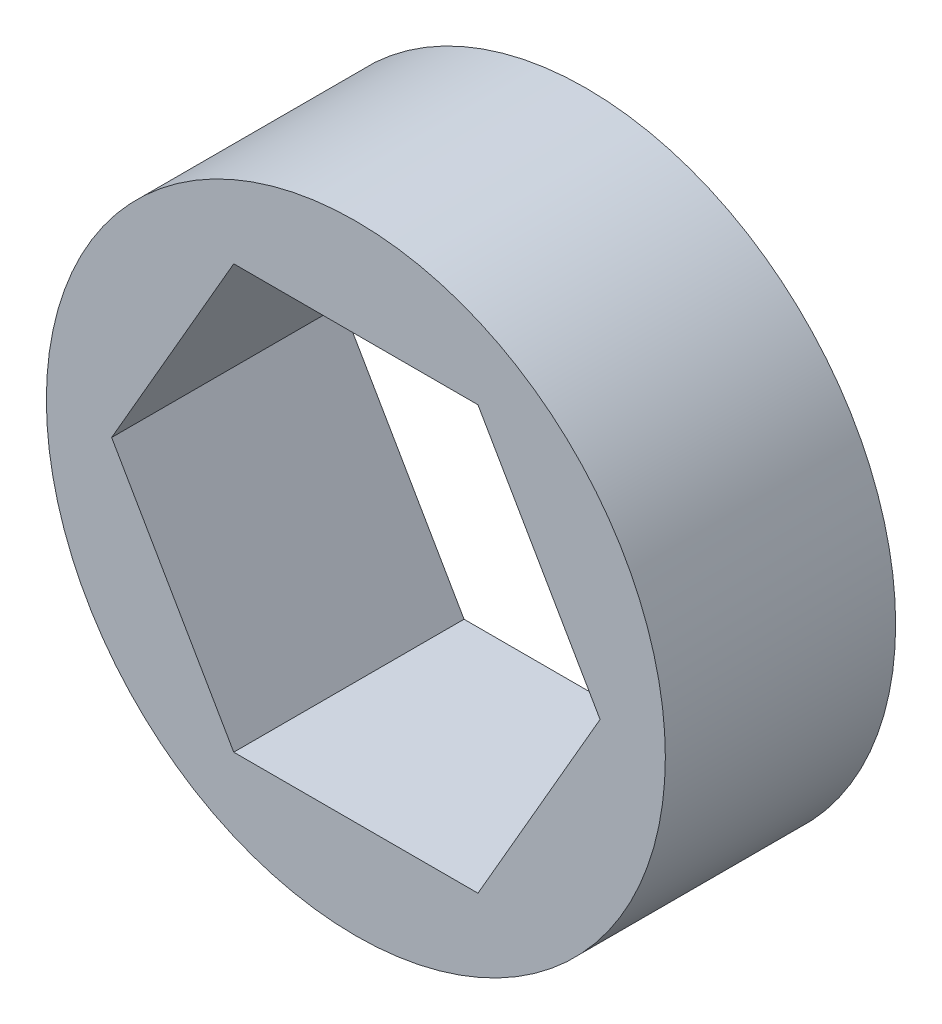
ISO-10303-21;
HEADER;
FILE_DESCRIPTION(('STEP AP214'),'2;1');
FILE_NAME('part.step','',(''),(''),'','','');
FILE_SCHEMA(('AUTOMOTIVE_DESIGN { 1 0 10303 214 1 1 1 1 }'));
ENDSEC;
DATA;
#1=APPLICATION_CONTEXT('core data for automotive mechanical design processes');
#2=APPLICATION_PROTOCOL_DEFINITION('international standard','automotive_design',2000,#1);
#3=PRODUCT_CONTEXT('',#1,'mechanical');
#4=PRODUCT('Part','Part','',(#3));
#5=PRODUCT_RELATED_PRODUCT_CATEGORY('part','',(#4));
#6=PRODUCT_DEFINITION_FORMATION('','',#4);
#7=PRODUCT_DEFINITION_CONTEXT('part definition',#1,'design');
#8=PRODUCT_DEFINITION('design','',#6,#7);
#9=PRODUCT_DEFINITION_SHAPE('','',#8);
#10=(LENGTH_UNIT() NAMED_UNIT(*) SI_UNIT(.MILLI.,.METRE.));
#11=(NAMED_UNIT(*) PLANE_ANGLE_UNIT() SI_UNIT($,.RADIAN.));
#12=(NAMED_UNIT(*) SI_UNIT($,.STERADIAN.) SOLID_ANGLE_UNIT());
#13=UNCERTAINTY_MEASURE_WITH_UNIT(LENGTH_MEASURE(1.E-05),#10,'distance_accuracy_value','');
#14=(GEOMETRIC_REPRESENTATION_CONTEXT(3) GLOBAL_UNCERTAINTY_ASSIGNED_CONTEXT((#13)) GLOBAL_UNIT_ASSIGNED_CONTEXT((#10,
#11,#12)) REPRESENTATION_CONTEXT('',''));
#15=CARTESIAN_POINT('',(0.,0.,0.));
#16=DIRECTION('',(0.,0.,1.));
#17=DIRECTION('',(1.,0.,0.));
#18=AXIS2_PLACEMENT_3D('',#15,#16,#17);
#19=CARTESIAN_POINT('',(0.,0.,7.08753086));
#20=DIRECTION('',(0.,0.,1.));
#21=DIRECTION('',(1.,0.,0.));
#22=AXIS2_PLACEMENT_3D('',#19,#20,#21);
#23=PLANE('',#22);
#24=CARTESIAN_POINT('',(0.,0.,7.08753086));
#25=DIRECTION('',(0.,0.,1.));
#26=DIRECTION('',(1.,0.,0.));
#27=AXIS2_PLACEMENT_3D('',#24,#25,#26);
#28=CIRCLE('',#27,9.525);
#29=CARTESIAN_POINT('',(-9.525,0.,7.08753086));
#30=VERTEX_POINT('',#29);
#31=EDGE_CURVE('E11',#30,#30,#28,.T.);
#32=ORIENTED_EDGE('',*,*,#31,.T.);
#33=EDGE_LOOP('',(#32));
#34=FACE_BOUND('',#33,.T.);
#35=DIRECTION('',(-0.500000000000001,0.866025403784438,0.));
#36=VECTOR('',#35,1.);
#37=CARTESIAN_POINT('',(7.51565712917592,0.,7.08753086));
#38=LINE('',#37,#36);
#39=CARTESIAN_POINT('',(7.51565712917592,0.,7.08753086));
#40=VERTEX_POINT('',#39);
#41=CARTESIAN_POINT('',(3.75782856458794,6.50874999999997,7.08753086));
#42=VERTEX_POINT('',#41);
#43=EDGE_CURVE('E102',#40,#42,#38,.T.);
#44=ORIENTED_EDGE('',*,*,#43,.F.);
#45=DIRECTION('',(0.499999999999995,0.866025403784441,0.));
#46=VECTOR('',#45,1.);
#47=CARTESIAN_POINT('',(3.75782856458803,-6.50874999999992,7.08753086));
#48=LINE('',#47,#46);
#49=CARTESIAN_POINT('',(3.75782856458803,-6.50874999999992,7.08753086));
#50=VERTEX_POINT('',#49);
#51=EDGE_CURVE('E94',#50,#40,#48,.T.);
#52=ORIENTED_EDGE('',*,*,#51,.F.);
#53=DIRECTION('',(1.,0.,0.));
#54=VECTOR('',#53,1.);
#55=CARTESIAN_POINT('',(-3.7578285645879,-6.50875,7.08753086));
#56=LINE('',#55,#54);
#57=CARTESIAN_POINT('',(-3.7578285645879,-6.50875,7.08753086));
#58=VERTEX_POINT('',#57);
#59=EDGE_CURVE('E122',#58,#50,#56,.T.);
#60=ORIENTED_EDGE('',*,*,#59,.F.);
#61=DIRECTION('',(0.500000000000007,-0.866025403784435,0.));
#62=VECTOR('',#61,1.);
#63=CARTESIAN_POINT('',(-7.51565712917591,0.,7.08753086));
#64=LINE('',#63,#62);
#65=CARTESIAN_POINT('',(-7.51565712917591,0.,7.08753086));
#66=VERTEX_POINT('',#65);
#67=EDGE_CURVE('E120',#66,#58,#64,.T.);
#68=ORIENTED_EDGE('',*,*,#67,.F.);
#69=DIRECTION('',(-0.499999999999995,-0.866025403784442,0.));
#70=VECTOR('',#69,1.);
#71=CARTESIAN_POINT('',(-3.75782856458799,6.50874999999995,7.08753086));
#72=LINE('',#71,#70);
#73=CARTESIAN_POINT('',(-3.75782856458799,6.50874999999995,7.08753086));
#74=VERTEX_POINT('',#73);
#75=EDGE_CURVE('E116',#74,#66,#72,.T.);
#76=ORIENTED_EDGE('',*,*,#75,.F.);
#77=DIRECTION('',(-1.,0.,0.));
#78=VECTOR('',#77,1.);
#79=CARTESIAN_POINT('',(3.75782856458794,6.50874999999997,7.08753086));
#80=LINE('',#79,#78);
#81=EDGE_CURVE('E114',#42,#74,#80,.T.);
#82=ORIENTED_EDGE('',*,*,#81,.F.);
#83=EDGE_LOOP('',(#44,#52,#60,#68,#76,#82));
#84=FACE_BOUND('',#83,.T.);
#85=ADVANCED_FACE('F41',(#34,#84),#23,.T.);
#86=CARTESIAN_POINT('',(0.,0.,0.));
#87=DIRECTION('',(0.,0.,1.));
#88=DIRECTION('',(1.,0.,0.));
#89=AXIS2_PLACEMENT_3D('',#86,#87,#88);
#90=PLANE('',#89);
#91=CARTESIAN_POINT('',(0.,0.,0.));
#92=DIRECTION('',(0.,0.,1.));
#93=DIRECTION('',(1.,0.,0.));
#94=AXIS2_PLACEMENT_3D('',#91,#92,#93);
#95=CIRCLE('',#94,9.525);
#96=CARTESIAN_POINT('',(-9.525,0.,0.));
#97=VERTEX_POINT('',#96);
#98=EDGE_CURVE('E45',#97,#97,#95,.T.);
#99=ORIENTED_EDGE('',*,*,#98,.F.);
#100=EDGE_LOOP('',(#99));
#101=FACE_BOUND('',#100,.T.);
#102=DIRECTION('',(0.499999999999995,0.866025403784441,0.));
#103=VECTOR('',#102,1.);
#104=CARTESIAN_POINT('',(3.75782856458803,-6.50874999999992,0.));
#105=LINE('',#104,#103);
#106=CARTESIAN_POINT('',(3.75782856458803,-6.50874999999992,0.));
#107=VERTEX_POINT('',#106);
#108=CARTESIAN_POINT('',(7.51565712917592,0.,0.));
#109=VERTEX_POINT('',#108);
#110=EDGE_CURVE('E64',#107,#109,#105,.T.);
#111=ORIENTED_EDGE('',*,*,#110,.T.);
#112=DIRECTION('',(-0.500000000000001,0.866025403784438,0.));
#113=VECTOR('',#112,1.);
#114=CARTESIAN_POINT('',(7.51565712917592,0.,0.));
#115=LINE('',#114,#113);
#116=CARTESIAN_POINT('',(3.75782856458794,6.50874999999997,0.));
#117=VERTEX_POINT('',#116);
#118=EDGE_CURVE('E109',#109,#117,#115,.T.);
#119=ORIENTED_EDGE('',*,*,#118,.T.);
#120=DIRECTION('',(-1.,0.,0.));
#121=VECTOR('',#120,1.);
#122=CARTESIAN_POINT('',(3.75782856458794,6.50874999999997,0.));
#123=LINE('',#122,#121);
#124=CARTESIAN_POINT('',(-3.75782856458799,6.50874999999995,0.));
#125=VERTEX_POINT('',#124);
#126=EDGE_CURVE('E126',#117,#125,#123,.T.);
#127=ORIENTED_EDGE('',*,*,#126,.T.);
#128=DIRECTION('',(-0.499999999999995,-0.866025403784442,0.));
#129=VECTOR('',#128,1.);
#130=CARTESIAN_POINT('',(-3.75782856458799,6.50874999999995,0.));
#131=LINE('',#130,#129);
#132=CARTESIAN_POINT('',(-7.51565712917591,0.,0.));
#133=VERTEX_POINT('',#132);
#134=EDGE_CURVE('E129',#125,#133,#131,.T.);
#135=ORIENTED_EDGE('',*,*,#134,.T.);
#136=DIRECTION('',(0.500000000000007,-0.866025403784435,0.));
#137=VECTOR('',#136,1.);
#138=CARTESIAN_POINT('',(-7.51565712917591,0.,0.));
#139=LINE('',#138,#137);
#140=CARTESIAN_POINT('',(-3.7578285645879,-6.50875,0.));
#141=VERTEX_POINT('',#140);
#142=EDGE_CURVE('E132',#133,#141,#139,.T.);
#143=ORIENTED_EDGE('',*,*,#142,.T.);
#144=DIRECTION('',(1.,0.,0.));
#145=VECTOR('',#144,1.);
#146=CARTESIAN_POINT('',(-3.7578285645879,-6.50875,0.));
#147=LINE('',#146,#145);
#148=EDGE_CURVE('E103',#141,#107,#147,.T.);
#149=ORIENTED_EDGE('',*,*,#148,.T.);
#150=EDGE_LOOP('',(#111,#119,#127,#135,#143,#149));
#151=FACE_BOUND('',#150,.T.);
#152=ADVANCED_FACE('F149',(#101,#151),#90,.F.);
#153=CARTESIAN_POINT('',(0.,0.,7.08753086));
#154=DIRECTION('',(0.,0.,-1.));
#155=DIRECTION('',(-1.,0.,0.));
#156=AXIS2_PLACEMENT_3D('',#153,#154,#155);
#157=CYLINDRICAL_SURFACE('',#156,9.525);
#158=CARTESIAN_POINT('',(-9.525,0.,7.08753086));
#159=CARTESIAN_POINT('',(-9.525,0.,7.01370241354167));
#160=CARTESIAN_POINT('',(-9.525,0.,6.93987396708333));
#161=CARTESIAN_POINT('',(-9.525,0.,6.79221707416667));
#162=CARTESIAN_POINT('',(-9.525,0.,6.71838862770833));
#163=CARTESIAN_POINT('',(-9.525,0.,6.57073173479167));
#164=CARTESIAN_POINT('',(-9.525,0.,6.49690328833333));
#165=CARTESIAN_POINT('',(-9.525,0.,6.34924639541667));
#166=CARTESIAN_POINT('',(-9.525,0.,6.27541794895833));
#167=CARTESIAN_POINT('',(-9.525,0.,6.12776105604167));
#168=CARTESIAN_POINT('',(-9.525,0.,6.05393260958333));
#169=CARTESIAN_POINT('',(-9.525,0.,5.90627571666667));
#170=CARTESIAN_POINT('',(-9.525,0.,5.83244727020833));
#171=CARTESIAN_POINT('',(-9.525,0.,5.68479037729167));
#172=CARTESIAN_POINT('',(-9.525,0.,5.61096193083333));
#173=CARTESIAN_POINT('',(-9.525,0.,5.46330503791667));
#174=CARTESIAN_POINT('',(-9.525,0.,5.38947659145833));
#175=CARTESIAN_POINT('',(-9.525,0.,5.24181969854167));
#176=CARTESIAN_POINT('',(-9.525,0.,5.16799125208333));
#177=CARTESIAN_POINT('',(-9.525,0.,5.02033435916667));
#178=CARTESIAN_POINT('',(-9.525,0.,4.94650591270833));
#179=CARTESIAN_POINT('',(-9.525,0.,4.79884901979167));
#180=CARTESIAN_POINT('',(-9.525,0.,4.72502057333333));
#181=CARTESIAN_POINT('',(-9.525,0.,4.57736368041667));
#182=CARTESIAN_POINT('',(-9.525,0.,4.50353523395833));
#183=CARTESIAN_POINT('',(-9.525,0.,4.35587834104167));
#184=CARTESIAN_POINT('',(-9.525,0.,4.28204989458333));
#185=CARTESIAN_POINT('',(-9.525,0.,4.13439300166667));
#186=CARTESIAN_POINT('',(-9.525,0.,4.06056455520833));
#187=CARTESIAN_POINT('',(-9.525,0.,3.91290766229167));
#188=CARTESIAN_POINT('',(-9.525,0.,3.83907921583333));
#189=CARTESIAN_POINT('',(-9.525,0.,3.69142232291667));
#190=CARTESIAN_POINT('',(-9.525,0.,3.61759387645833));
#191=CARTESIAN_POINT('',(-9.525,0.,3.46993698354167));
#192=CARTESIAN_POINT('',(-9.525,0.,3.39610853708333));
#193=CARTESIAN_POINT('',(-9.525,0.,3.24845164416667));
#194=CARTESIAN_POINT('',(-9.525,0.,3.17462319770833));
#195=CARTESIAN_POINT('',(-9.525,0.,3.02696630479167));
#196=CARTESIAN_POINT('',(-9.525,0.,2.95313785833333));
#197=CARTESIAN_POINT('',(-9.525,0.,2.80548096541667));
#198=CARTESIAN_POINT('',(-9.525,0.,2.73165251895833));
#199=CARTESIAN_POINT('',(-9.525,0.,2.58399562604167));
#200=CARTESIAN_POINT('',(-9.525,0.,2.51016717958333));
#201=CARTESIAN_POINT('',(-9.525,0.,2.36251028666667));
#202=CARTESIAN_POINT('',(-9.525,0.,2.28868184020833));
#203=CARTESIAN_POINT('',(-9.525,0.,2.14102494729167));
#204=CARTESIAN_POINT('',(-9.525,0.,2.06719650083333));
#205=CARTESIAN_POINT('',(-9.525,0.,1.91953960791667));
#206=CARTESIAN_POINT('',(-9.525,0.,1.84571116145833));
#207=CARTESIAN_POINT('',(-9.525,0.,1.69805426854167));
#208=CARTESIAN_POINT('',(-9.525,0.,1.62422582208333));
#209=CARTESIAN_POINT('',(-9.525,0.,1.47656892916667));
#210=CARTESIAN_POINT('',(-9.525,0.,1.40274048270833));
#211=CARTESIAN_POINT('',(-9.525,0.,1.25508358979167));
#212=CARTESIAN_POINT('',(-9.525,0.,1.18125514333333));
#213=CARTESIAN_POINT('',(-9.525,0.,1.03359825041667));
#214=CARTESIAN_POINT('',(-9.525,0.,0.959769803958333));
#215=CARTESIAN_POINT('',(-9.525,0.,0.812112911041666));
#216=CARTESIAN_POINT('',(-9.525,0.,0.738284464583332));
#217=CARTESIAN_POINT('',(-9.525,0.,0.590627571666665));
#218=CARTESIAN_POINT('',(-9.525,0.,0.516799125208332));
#219=CARTESIAN_POINT('',(-9.525,0.,0.369142232291666));
#220=CARTESIAN_POINT('',(-9.525,0.,0.295313785833332));
#221=CARTESIAN_POINT('',(-9.525,0.,0.147656892916666));
#222=CARTESIAN_POINT('',(-9.525,0.,0.0738284464583324));
#223=CARTESIAN_POINT('',(-9.525,0.,0.));
#224=B_SPLINE_CURVE_WITH_KNOTS('',3,(#158,#159,#160,#161,#162,#163,#164,#165,#166,#167,#168,
#169,#170,#171,#172,#173,#174,#175,#176,#177,#178,#179,#180,#181,#182,#183,#184,#185,#186,#187,
#188,#189,#190,#191,#192,#193,#194,#195,#196,#197,#198,#199,#200,#201,#202,#203,#204,#205,#206,
#207,#208,#209,#210,#211,#212,#213,#214,#215,#216,#217,#218,#219,#220,#221,#222,#223),
.UNSPECIFIED.,.F.,.F.,(4,2,2,2,2,2,2,2,2,2,2,2,2,2,2,2,2,2,2,2,2,2,2,2,2,2,2,2,2,2,2,2,4),(0.,
0.221485339375,0.44297067875,0.664456018125,0.8859413575,1.107426696875,1.32891203625,
1.550397375625,1.771882715,1.993368054375,2.21485339375,2.436338733125,2.6578240725,
2.879309411875,3.10079475125,3.322280090625,3.54376543,3.765250769375,3.98673610875,
4.208221448125,4.4297067875,4.651192126875,4.87267746625,5.094162805625,5.315648145,
5.537133484375,5.75861882375,5.980104163125,6.2015895025,6.423074841875,6.64456018125,
6.866045520625,7.08753086),.UNSPECIFIED.);
#225=EDGE_CURVE('BSEAM43',#30,#97,#224,.T.);
#226=ORIENTED_EDGE('',*,*,#31,.F.);
#227=ORIENTED_EDGE('',*,*,#98,.T.);
#228=ORIENTED_EDGE('',*,*,#225,.T.);
#229=ORIENTED_EDGE('',*,*,#225,.F.);
#230=EDGE_LOOP('',(#226,#228,#227,#229));
#231=FACE_BOUND('',#230,.T.);
#232=ADVANCED_FACE('F43',(#231),#157,.T.);
#233=CARTESIAN_POINT('',(3.75782856458803,-6.50874999999992,7.08753086));
#234=DIRECTION('',(-0.866025403784441,0.499999999999995,0.));
#235=DIRECTION('',(-0.499999999999995,-0.866025403784442,0.));
#236=AXIS2_PLACEMENT_3D('',#233,#234,#235);
#237=PLANE('',#236);
#238=ORIENTED_EDGE('',*,*,#110,.F.);
#239=DIRECTION('',(0.,0.,-1.));
#240=VECTOR('',#239,1.);
#241=CARTESIAN_POINT('',(3.75782856458803,-6.50874999999992,7.08753086));
#242=LINE('',#241,#240);
#243=EDGE_CURVE('E98',#50,#107,#242,.T.);
#244=ORIENTED_EDGE('',*,*,#243,.F.);
#245=ORIENTED_EDGE('',*,*,#51,.T.);
#246=DIRECTION('',(0.,0.,-1.));
#247=VECTOR('',#246,1.);
#248=CARTESIAN_POINT('',(7.51565712917592,0.,7.08753086));
#249=LINE('',#248,#247);
#250=EDGE_CURVE('E97',#40,#109,#249,.T.);
#251=ORIENTED_EDGE('',*,*,#250,.T.);
#252=EDGE_LOOP('',(#238,#244,#245,#251));
#253=FACE_BOUND('',#252,.T.);
#254=ADVANCED_FACE('F96',(#253),#237,.T.);
#255=CARTESIAN_POINT('',(7.51565712917592,0.,7.08753086));
#256=DIRECTION('',(-0.866025403784438,-0.500000000000001,0.));
#257=DIRECTION('',(0.500000000000001,-0.866025403784438,0.));
#258=AXIS2_PLACEMENT_3D('',#255,#256,#257);
#259=PLANE('',#258);
#260=ORIENTED_EDGE('',*,*,#118,.F.);
#261=ORIENTED_EDGE('',*,*,#250,.F.);
#262=ORIENTED_EDGE('',*,*,#43,.T.);
#263=DIRECTION('',(0.,0.,-1.));
#264=VECTOR('',#263,1.);
#265=CARTESIAN_POINT('',(3.75782856458794,6.50874999999997,7.08753086));
#266=LINE('',#265,#264);
#267=EDGE_CURVE('E110',#42,#117,#266,.T.);
#268=ORIENTED_EDGE('',*,*,#267,.T.);
#269=EDGE_LOOP('',(#260,#261,#262,#268));
#270=FACE_BOUND('',#269,.T.);
#271=ADVANCED_FACE('F106',(#270),#259,.T.);
#272=CARTESIAN_POINT('',(3.75782856458794,6.50874999999997,7.08753086));
#273=DIRECTION('',(0.,-1.,0.));
#274=DIRECTION('',(1.,0.,0.));
#275=AXIS2_PLACEMENT_3D('',#272,#273,#274);
#276=PLANE('',#275);
#277=ORIENTED_EDGE('',*,*,#126,.F.);
#278=ORIENTED_EDGE('',*,*,#267,.F.);
#279=ORIENTED_EDGE('',*,*,#81,.T.);
#280=DIRECTION('',(0.,0.,-1.));
#281=VECTOR('',#280,1.);
#282=CARTESIAN_POINT('',(-3.75782856458799,6.50874999999995,7.08753086));
#283=LINE('',#282,#281);
#284=EDGE_CURVE('E141',#74,#125,#283,.T.);
#285=ORIENTED_EDGE('',*,*,#284,.T.);
#286=EDGE_LOOP('',(#277,#278,#279,#285));
#287=FACE_BOUND('',#286,.T.);
#288=ADVANCED_FACE('F145',(#287),#276,.T.);
#289=CARTESIAN_POINT('',(-3.75782856458799,6.50874999999995,7.08753086));
#290=DIRECTION('',(0.866025403784441,-0.499999999999995,0.));
#291=DIRECTION('',(0.499999999999995,0.866025403784442,0.));
#292=AXIS2_PLACEMENT_3D('',#289,#290,#291);
#293=PLANE('',#292);
#294=ORIENTED_EDGE('',*,*,#134,.F.);
#295=ORIENTED_EDGE('',*,*,#284,.F.);
#296=ORIENTED_EDGE('',*,*,#75,.T.);
#297=DIRECTION('',(0.,0.,-1.));
#298=VECTOR('',#297,1.);
#299=CARTESIAN_POINT('',(-7.51565712917591,0.,7.08753086));
#300=LINE('',#299,#298);
#301=EDGE_CURVE('E139',#66,#133,#300,.T.);
#302=ORIENTED_EDGE('',*,*,#301,.T.);
#303=EDGE_LOOP('',(#294,#295,#296,#302));
#304=FACE_BOUND('',#303,.T.);
#305=ADVANCED_FACE('F157',(#304),#293,.T.);
#306=CARTESIAN_POINT('',(-7.51565712917591,0.,7.08753086));
#307=DIRECTION('',(0.866025403784434,0.500000000000007,0.));
#308=DIRECTION('',(-0.500000000000007,0.866025403784434,0.));
#309=AXIS2_PLACEMENT_3D('',#306,#307,#308);
#310=PLANE('',#309);
#311=ORIENTED_EDGE('',*,*,#142,.F.);
#312=ORIENTED_EDGE('',*,*,#301,.F.);
#313=ORIENTED_EDGE('',*,*,#67,.T.);
#314=DIRECTION('',(0.,0.,-1.));
#315=VECTOR('',#314,1.);
#316=CARTESIAN_POINT('',(-3.7578285645879,-6.50875,7.08753086));
#317=LINE('',#316,#315);
#318=EDGE_CURVE('E56',#58,#141,#317,.T.);
#319=ORIENTED_EDGE('',*,*,#318,.T.);
#320=EDGE_LOOP('',(#311,#312,#313,#319));
#321=FACE_BOUND('',#320,.T.);
#322=ADVANCED_FACE('F155',(#321),#310,.T.);
#323=CARTESIAN_POINT('',(-3.7578285645879,-6.50875,7.08753086));
#324=DIRECTION('',(0.,1.,0.));
#325=DIRECTION('',(-1.,0.,0.));
#326=AXIS2_PLACEMENT_3D('',#323,#324,#325);
#327=PLANE('',#326);
#328=ORIENTED_EDGE('',*,*,#148,.F.);
#329=ORIENTED_EDGE('',*,*,#318,.F.);
#330=ORIENTED_EDGE('',*,*,#59,.T.);
#331=ORIENTED_EDGE('',*,*,#243,.T.);
#332=EDGE_LOOP('',(#328,#329,#330,#331));
#333=FACE_BOUND('',#332,.T.);
#334=ADVANCED_FACE('F151',(#333),#327,.T.);
#335=CLOSED_SHELL('',(#85,#152,#232,#254,#271,#288,#305,#322,#334));
#336=MANIFOLD_SOLID_BREP('B2',#335);
#337=ADVANCED_BREP_SHAPE_REPRESENTATION('',(#18,#336),#14);
#338=SHAPE_DEFINITION_REPRESENTATION(#9,#337);
ENDSEC;
END-ISO-10303-21;
